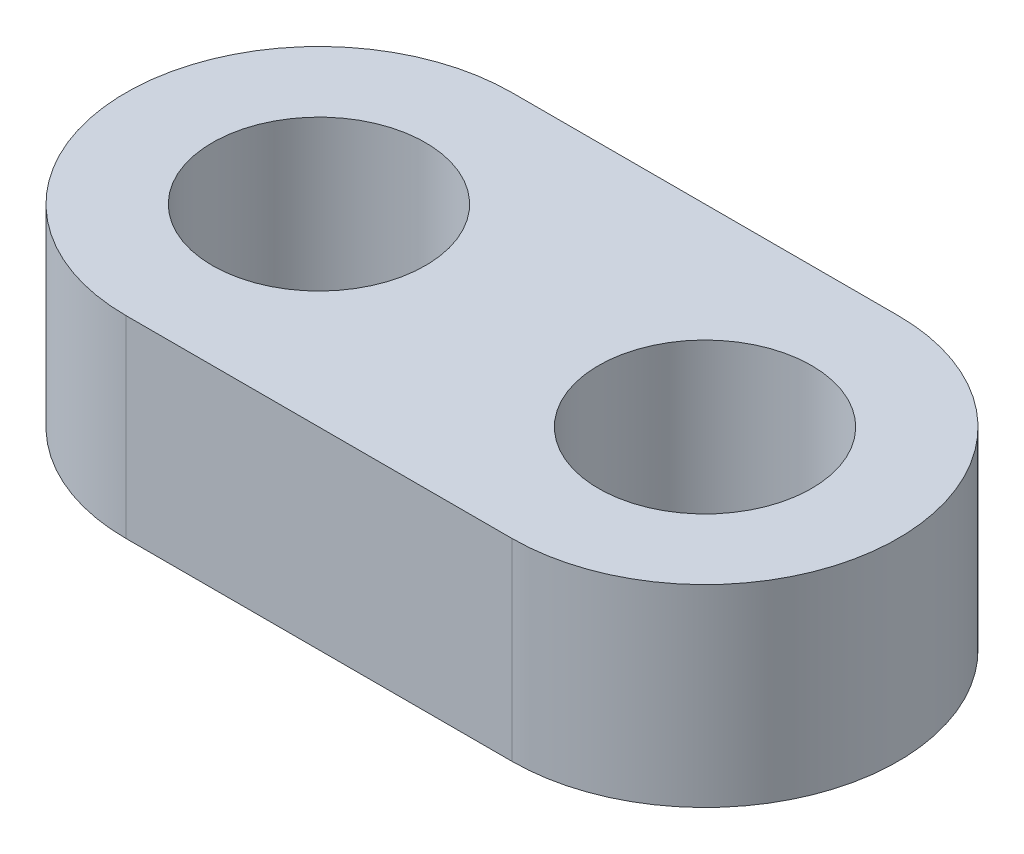
ISO-10303-21;
HEADER;
FILE_DESCRIPTION(('STEP AP214'),'2;1');
FILE_NAME('part.step','',(''),(''),'','','');
FILE_SCHEMA(('AUTOMOTIVE_DESIGN { 1 0 10303 214 1 1 1 1 }'));
ENDSEC;
DATA;
#1=APPLICATION_CONTEXT('core data for automotive mechanical design processes');
#2=APPLICATION_PROTOCOL_DEFINITION('international standard','automotive_design',2000,#1);
#3=PRODUCT_CONTEXT('',#1,'mechanical');
#4=PRODUCT('Part','Part','',(#3));
#5=PRODUCT_RELATED_PRODUCT_CATEGORY('part','',(#4));
#6=PRODUCT_DEFINITION_FORMATION('','',#4);
#7=PRODUCT_DEFINITION_CONTEXT('part definition',#1,'design');
#8=PRODUCT_DEFINITION('design','',#6,#7);
#9=PRODUCT_DEFINITION_SHAPE('','',#8);
#10=(LENGTH_UNIT() NAMED_UNIT(*) SI_UNIT(.MILLI.,.METRE.));
#11=(NAMED_UNIT(*) PLANE_ANGLE_UNIT() SI_UNIT($,.RADIAN.));
#12=(NAMED_UNIT(*) SI_UNIT($,.STERADIAN.) SOLID_ANGLE_UNIT());
#13=UNCERTAINTY_MEASURE_WITH_UNIT(LENGTH_MEASURE(1.E-05),#10,'distance_accuracy_value','');
#14=(GEOMETRIC_REPRESENTATION_CONTEXT(3) GLOBAL_UNCERTAINTY_ASSIGNED_CONTEXT((#13)) GLOBAL_UNIT_ASSIGNED_CONTEXT((#10,
#11,#12)) REPRESENTATION_CONTEXT('',''));
#15=CARTESIAN_POINT('',(0.,0.,0.));
#16=DIRECTION('',(0.,0.,1.));
#17=DIRECTION('',(1.,0.,0.));
#18=AXIS2_PLACEMENT_3D('',#15,#16,#17);
#19=CARTESIAN_POINT('',(-3.175,3.175,0.));
#20=DIRECTION('',(0.,1.,0.));
#21=DIRECTION('',(0.,0.,1.));
#22=AXIS2_PLACEMENT_3D('',#19,#20,#21);
#23=PLANE('',#22);
#24=CARTESIAN_POINT('',(-3.175,3.175,0.));
#25=DIRECTION('',(0.,1.,0.));
#26=DIRECTION('',(0.,0.,1.));
#27=AXIS2_PLACEMENT_3D('',#24,#25,#26);
#28=CIRCLE('',#27,1.7526);
#29=CARTESIAN_POINT('',(-3.175,3.175,1.7526));
#30=VERTEX_POINT('',#29);
#31=EDGE_CURVE('E102',#30,#30,#28,.T.);
#32=ORIENTED_EDGE('',*,*,#31,.F.);
#33=EDGE_LOOP('',(#32));
#34=FACE_BOUND('',#33,.T.);
#35=CARTESIAN_POINT('',(-3.175,3.175,0.));
#36=DIRECTION('',(0.,1.,0.));
#37=DIRECTION('',(0.,0.,1.));
#38=AXIS2_PLACEMENT_3D('',#35,#36,#37);
#39=CIRCLE('',#38,3.175);
#40=CARTESIAN_POINT('',(-3.175,3.175,-3.175));
#41=VERTEX_POINT('',#40);
#42=CARTESIAN_POINT('',(-3.175,3.175,3.175));
#43=VERTEX_POINT('',#42);
#44=EDGE_CURVE('E87',#41,#43,#39,.T.);
#45=ORIENTED_EDGE('',*,*,#44,.T.);
#46=DIRECTION('',(1.,0.,0.));
#47=VECTOR('',#46,1.);
#48=CARTESIAN_POINT('',(-3.175,3.175,3.175));
#49=LINE('',#48,#47);
#50=CARTESIAN_POINT('',(3.175,3.175,3.175));
#51=VERTEX_POINT('',#50);
#52=EDGE_CURVE('E82',#43,#51,#49,.T.);
#53=ORIENTED_EDGE('',*,*,#52,.T.);
#54=CARTESIAN_POINT('',(3.175,3.175,0.));
#55=DIRECTION('',(0.,1.,0.));
#56=DIRECTION('',(0.,0.,1.));
#57=AXIS2_PLACEMENT_3D('',#54,#55,#56);
#58=CIRCLE('',#57,3.175);
#59=CARTESIAN_POINT('',(3.175,3.175,-3.175));
#60=VERTEX_POINT('',#59);
#61=EDGE_CURVE('E85',#51,#60,#58,.T.);
#62=ORIENTED_EDGE('',*,*,#61,.T.);
#63=DIRECTION('',(-1.,0.,0.));
#64=VECTOR('',#63,1.);
#65=CARTESIAN_POINT('',(-3.175,3.175,-3.175));
#66=LINE('',#65,#64);
#67=EDGE_CURVE('E52',#60,#41,#66,.T.);
#68=ORIENTED_EDGE('',*,*,#67,.T.);
#69=EDGE_LOOP('',(#45,#53,#62,#68));
#70=FACE_BOUND('',#69,.T.);
#71=CARTESIAN_POINT('',(3.175,3.175,0.));
#72=DIRECTION('',(0.,1.,0.));
#73=DIRECTION('',(0.,0.,-1.));
#74=AXIS2_PLACEMENT_3D('',#71,#72,#73);
#75=CIRCLE('',#74,1.7526);
#76=CARTESIAN_POINT('',(3.175,3.175,-1.7526));
#77=VERTEX_POINT('',#76);
#78=EDGE_CURVE('E117',#77,#77,#75,.T.);
#79=ORIENTED_EDGE('',*,*,#78,.F.);
#80=EDGE_LOOP('',(#79));
#81=FACE_BOUND('',#80,.T.);
#82=ADVANCED_FACE('F35',(#34,#70,#81),#23,.T.);
#83=CARTESIAN_POINT('',(-3.175,0.,0.));
#84=DIRECTION('',(0.,1.,0.));
#85=DIRECTION('',(0.,0.,1.));
#86=AXIS2_PLACEMENT_3D('',#83,#84,#85);
#87=PLANE('',#86);
#88=CARTESIAN_POINT('',(-3.175,0.,0.));
#89=DIRECTION('',(0.,1.,0.));
#90=DIRECTION('',(0.,0.,1.));
#91=AXIS2_PLACEMENT_3D('',#88,#89,#90);
#92=CIRCLE('',#91,3.175);
#93=CARTESIAN_POINT('',(-3.175,0.,-3.175));
#94=VERTEX_POINT('',#93);
#95=CARTESIAN_POINT('',(-3.175,0.,3.175));
#96=VERTEX_POINT('',#95);
#97=EDGE_CURVE('E99',#94,#96,#92,.T.);
#98=ORIENTED_EDGE('',*,*,#97,.F.);
#99=DIRECTION('',(-1.,0.,0.));
#100=VECTOR('',#99,1.);
#101=CARTESIAN_POINT('',(-3.175,0.,-3.175));
#102=LINE('',#101,#100);
#103=CARTESIAN_POINT('',(3.175,0.,-3.175));
#104=VERTEX_POINT('',#103);
#105=EDGE_CURVE('E75',#104,#94,#102,.T.);
#106=ORIENTED_EDGE('',*,*,#105,.F.);
#107=CARTESIAN_POINT('',(3.175,0.,0.));
#108=DIRECTION('',(0.,1.,0.));
#109=DIRECTION('',(0.,0.,1.));
#110=AXIS2_PLACEMENT_3D('',#107,#108,#109);
#111=CIRCLE('',#110,3.175);
#112=CARTESIAN_POINT('',(3.175,0.,3.175));
#113=VERTEX_POINT('',#112);
#114=EDGE_CURVE('E69',#113,#104,#111,.T.);
#115=ORIENTED_EDGE('',*,*,#114,.F.);
#116=DIRECTION('',(1.,0.,0.));
#117=VECTOR('',#116,1.);
#118=CARTESIAN_POINT('',(-3.175,0.,3.175));
#119=LINE('',#118,#117);
#120=EDGE_CURVE('E91',#96,#113,#119,.T.);
#121=ORIENTED_EDGE('',*,*,#120,.F.);
#122=EDGE_LOOP('',(#98,#106,#115,#121));
#123=FACE_BOUND('',#122,.T.);
#124=CARTESIAN_POINT('',(-3.175,0.,0.));
#125=DIRECTION('',(0.,1.,0.));
#126=DIRECTION('',(0.,0.,1.));
#127=AXIS2_PLACEMENT_3D('',#124,#125,#126);
#128=CIRCLE('',#127,1.7526);
#129=CARTESIAN_POINT('',(-3.175,0.,1.7526));
#130=VERTEX_POINT('',#129);
#131=EDGE_CURVE('E114',#130,#130,#128,.T.);
#132=ORIENTED_EDGE('',*,*,#131,.T.);
#133=EDGE_LOOP('',(#132));
#134=FACE_BOUND('',#133,.T.);
#135=CARTESIAN_POINT('',(3.175,0.,0.));
#136=DIRECTION('',(0.,1.,0.));
#137=DIRECTION('',(0.,0.,-1.));
#138=AXIS2_PLACEMENT_3D('',#135,#136,#137);
#139=CIRCLE('',#138,1.7526);
#140=CARTESIAN_POINT('',(3.175,0.,-1.7526));
#141=VERTEX_POINT('',#140);
#142=EDGE_CURVE('E120',#141,#141,#139,.T.);
#143=ORIENTED_EDGE('',*,*,#142,.T.);
#144=EDGE_LOOP('',(#143));
#145=FACE_BOUND('',#144,.T.);
#146=ADVANCED_FACE('F110',(#123,#134,#145),#87,.F.);
#147=CARTESIAN_POINT('',(-3.175,3.175,0.));
#148=DIRECTION('',(0.,-1.,0.));
#149=DIRECTION('',(0.,0.,-1.));
#150=AXIS2_PLACEMENT_3D('',#147,#148,#149);
#151=CYLINDRICAL_SURFACE('',#150,3.175);
#152=ORIENTED_EDGE('',*,*,#97,.T.);
#153=DIRECTION('',(0.,-1.,0.));
#154=VECTOR('',#153,1.);
#155=CARTESIAN_POINT('',(-3.175,3.175,3.175));
#156=LINE('',#155,#154);
#157=EDGE_CURVE('E11',#43,#96,#156,.T.);
#158=ORIENTED_EDGE('',*,*,#157,.F.);
#159=ORIENTED_EDGE('',*,*,#44,.F.);
#160=DIRECTION('',(0.,-1.,0.));
#161=VECTOR('',#160,1.);
#162=CARTESIAN_POINT('',(-3.175,3.175,-3.175));
#163=LINE('',#162,#161);
#164=EDGE_CURVE('E95',#41,#94,#163,.T.);
#165=ORIENTED_EDGE('',*,*,#164,.T.);
#166=EDGE_LOOP('',(#152,#158,#159,#165));
#167=FACE_BOUND('',#166,.T.);
#168=ADVANCED_FACE('F37',(#167),#151,.T.);
#169=CARTESIAN_POINT('',(-3.175,3.175,3.175));
#170=DIRECTION('',(0.,0.,-1.));
#171=DIRECTION('',(-1.,0.,0.));
#172=AXIS2_PLACEMENT_3D('',#169,#170,#171);
#173=PLANE('',#172);
#174=ORIENTED_EDGE('',*,*,#120,.T.);
#175=DIRECTION('',(0.,-1.,0.));
#176=VECTOR('',#175,1.);
#177=CARTESIAN_POINT('',(3.175,3.175,3.175));
#178=LINE('',#177,#176);
#179=EDGE_CURVE('E44',#51,#113,#178,.T.);
#180=ORIENTED_EDGE('',*,*,#179,.F.);
#181=ORIENTED_EDGE('',*,*,#52,.F.);
#182=ORIENTED_EDGE('',*,*,#157,.T.);
#183=EDGE_LOOP('',(#174,#180,#181,#182));
#184=FACE_BOUND('',#183,.T.);
#185=ADVANCED_FACE('F90',(#184),#173,.F.);
#186=CARTESIAN_POINT('',(3.175,3.175,0.));
#187=DIRECTION('',(0.,-1.,0.));
#188=DIRECTION('',(0.,0.,-1.));
#189=AXIS2_PLACEMENT_3D('',#186,#187,#188);
#190=CYLINDRICAL_SURFACE('',#189,3.175);
#191=ORIENTED_EDGE('',*,*,#114,.T.);
#192=DIRECTION('',(0.,-1.,0.));
#193=VECTOR('',#192,1.);
#194=CARTESIAN_POINT('',(3.175,3.175,-3.175));
#195=LINE('',#194,#193);
#196=EDGE_CURVE('E92',#60,#104,#195,.T.);
#197=ORIENTED_EDGE('',*,*,#196,.F.);
#198=ORIENTED_EDGE('',*,*,#61,.F.);
#199=ORIENTED_EDGE('',*,*,#179,.T.);
#200=EDGE_LOOP('',(#191,#197,#198,#199));
#201=FACE_BOUND('',#200,.T.);
#202=ADVANCED_FACE('F93',(#201),#190,.T.);
#203=CARTESIAN_POINT('',(-3.175,3.175,-3.175));
#204=DIRECTION('',(0.,0.,1.));
#205=DIRECTION('',(1.,0.,0.));
#206=AXIS2_PLACEMENT_3D('',#203,#204,#205);
#207=PLANE('',#206);
#208=ORIENTED_EDGE('',*,*,#105,.T.);
#209=ORIENTED_EDGE('',*,*,#164,.F.);
#210=ORIENTED_EDGE('',*,*,#67,.F.);
#211=ORIENTED_EDGE('',*,*,#196,.T.);
#212=EDGE_LOOP('',(#208,#209,#210,#211));
#213=FACE_BOUND('',#212,.T.);
#214=ADVANCED_FACE('F107',(#213),#207,.F.);
#215=CARTESIAN_POINT('',(-3.175,3.175,0.));
#216=DIRECTION('',(0.,-1.,0.));
#217=DIRECTION('',(0.,0.,-1.));
#218=AXIS2_PLACEMENT_3D('',#215,#216,#217);
#219=CYLINDRICAL_SURFACE('',#218,1.7526);
#220=ORIENTED_EDGE('',*,*,#31,.T.);
#221=EDGE_LOOP('',(#220));
#222=FACE_BOUND('',#221,.T.);
#223=ORIENTED_EDGE('',*,*,#131,.F.);
#224=EDGE_LOOP('',(#223));
#225=FACE_BOUND('',#224,.T.);
#226=ADVANCED_FACE('F137',(#222,#225),#219,.F.);
#227=CARTESIAN_POINT('',(3.175,3.175,0.));
#228=DIRECTION('',(0.,-1.,0.));
#229=DIRECTION('',(0.,0.,-1.));
#230=AXIS2_PLACEMENT_3D('',#227,#228,#229);
#231=CYLINDRICAL_SURFACE('',#230,1.7526);
#232=ORIENTED_EDGE('',*,*,#78,.T.);
#233=EDGE_LOOP('',(#232));
#234=FACE_BOUND('',#233,.T.);
#235=ORIENTED_EDGE('',*,*,#142,.F.);
#236=EDGE_LOOP('',(#235));
#237=FACE_BOUND('',#236,.T.);
#238=ADVANCED_FACE('F126',(#234,#237),#231,.F.);
#239=CLOSED_SHELL('',(#82,#146,#168,#185,#202,#214,#226,#238));
#240=MANIFOLD_SOLID_BREP('B2',#239);
#241=ADVANCED_BREP_SHAPE_REPRESENTATION('',(#18,#240),#14);
#242=SHAPE_DEFINITION_REPRESENTATION(#9,#241);
ENDSEC;
END-ISO-10303-21;
